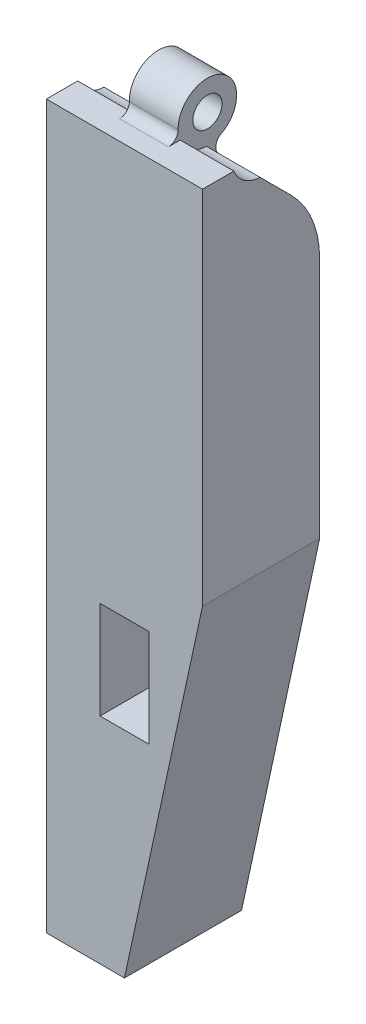
ISO-10303-21;
HEADER;
FILE_DESCRIPTION(('STEP AP214'),'2;1');
FILE_NAME('part.step','',(''),(''),'','','');
FILE_SCHEMA(('AUTOMOTIVE_DESIGN { 1 0 10303 214 1 1 1 1 }'));
ENDSEC;
DATA;
#1=APPLICATION_CONTEXT('core data for automotive mechanical design processes');
#2=APPLICATION_PROTOCOL_DEFINITION('international standard','automotive_design',2000,#1);
#3=PRODUCT_CONTEXT('',#1,'mechanical');
#4=PRODUCT('Part','Part','',(#3));
#5=PRODUCT_RELATED_PRODUCT_CATEGORY('part','',(#4));
#6=PRODUCT_DEFINITION_FORMATION('','',#4);
#7=PRODUCT_DEFINITION_CONTEXT('part definition',#1,'design');
#8=PRODUCT_DEFINITION('design','',#6,#7);
#9=PRODUCT_DEFINITION_SHAPE('','',#8);
#10=(LENGTH_UNIT() NAMED_UNIT(*) SI_UNIT(.MILLI.,.METRE.));
#11=(NAMED_UNIT(*) PLANE_ANGLE_UNIT() SI_UNIT($,.RADIAN.));
#12=(NAMED_UNIT(*) SI_UNIT($,.STERADIAN.) SOLID_ANGLE_UNIT());
#13=UNCERTAINTY_MEASURE_WITH_UNIT(LENGTH_MEASURE(1.E-05),#10,'distance_accuracy_value','');
#14=(GEOMETRIC_REPRESENTATION_CONTEXT(3) GLOBAL_UNCERTAINTY_ASSIGNED_CONTEXT((#13)) GLOBAL_UNIT_ASSIGNED_CONTEXT((#10,
#11,#12)) REPRESENTATION_CONTEXT('',''));
#15=CARTESIAN_POINT('',(0.,0.,0.));
#16=DIRECTION('',(0.,0.,1.));
#17=DIRECTION('',(1.,0.,0.));
#18=AXIS2_PLACEMENT_3D('',#15,#16,#17);
#19=CARTESIAN_POINT('',(0.,0.,0.));
#20=DIRECTION('',(0.,0.,-1.));
#21=DIRECTION('',(-1.,0.,0.));
#22=AXIS2_PLACEMENT_3D('',#19,#20,#21);
#23=PLANE('',#22);
#24=DIRECTION('',(-1.,0.,0.));
#25=VECTOR('',#24,1.);
#26=CARTESIAN_POINT('',(0.,-5.86718317653569,0.));
#27=LINE('',#26,#25);
#28=CARTESIAN_POINT('',(10.5,-5.86718317653569,0.));
#29=VERTEX_POINT('',#28);
#30=CARTESIAN_POINT('',(5.5,-5.86718317653569,0.));
#31=VERTEX_POINT('',#30);
#32=EDGE_CURVE('E267',#29,#31,#27,.T.);
#33=ORIENTED_EDGE('',*,*,#32,.F.);
#34=DIRECTION('',(0.,1.,0.));
#35=VECTOR('',#34,1.);
#36=CARTESIAN_POINT('',(10.5,0.,0.));
#37=LINE('',#36,#35);
#38=CARTESIAN_POINT('',(10.5,4.13281682346432,0.));
#39=VERTEX_POINT('',#38);
#40=EDGE_CURVE('E260',#29,#39,#37,.T.);
#41=ORIENTED_EDGE('',*,*,#40,.T.);
#42=DIRECTION('',(-1.,0.,0.));
#43=VECTOR('',#42,1.);
#44=CARTESIAN_POINT('',(0.,4.13281682346432,0.));
#45=LINE('',#44,#43);
#46=CARTESIAN_POINT('',(5.5,4.13281682346432,0.));
#47=VERTEX_POINT('',#46);
#48=EDGE_CURVE('E273',#39,#47,#45,.T.);
#49=ORIENTED_EDGE('',*,*,#48,.T.);
#50=DIRECTION('',(0.,1.,0.));
#51=VECTOR('',#50,1.);
#52=CARTESIAN_POINT('',(5.5,0.,0.));
#53=LINE('',#52,#51);
#54=EDGE_CURVE('E270',#31,#47,#53,.T.);
#55=ORIENTED_EDGE('',*,*,#54,.F.);
#56=EDGE_LOOP('',(#33,#41,#49,#55));
#57=FACE_BOUND('',#56,.T.);
#58=DIRECTION('',(0.,-1.,0.));
#59=VECTOR('',#58,1.);
#60=CARTESIAN_POINT('',(0.,26.1328168234643,0.));
#61=LINE('',#60,#59);
#62=CARTESIAN_POINT('',(0.,13.9906811997334,0.));
#63=VERTEX_POINT('',#62);
#64=CARTESIAN_POINT('',(0.,-47.8671831765357,0.));
#65=VERTEX_POINT('',#64);
#66=EDGE_CURVE('E349',#63,#65,#61,.T.);
#67=ORIENTED_EDGE('',*,*,#66,.F.);
#68=DIRECTION('',(1.,0.,0.));
#69=VECTOR('',#68,1.);
#70=CARTESIAN_POINT('',(16.,13.9906811997334,0.));
#71=LINE('',#70,#69);
#72=CARTESIAN_POINT('',(16.,13.9906811997334,0.));
#73=VERTEX_POINT('',#72);
#74=EDGE_CURVE('E443',#63,#73,#71,.T.);
#75=ORIENTED_EDGE('',*,*,#74,.T.);
#76=DIRECTION('',(0.,1.,0.));
#77=VECTOR('',#76,1.);
#78=CARTESIAN_POINT('',(16.,26.1328168234643,0.));
#79=LINE('',#78,#77);
#80=CARTESIAN_POINT('',(16.,-10.8671831765357,0.));
#81=VERTEX_POINT('',#80);
#82=EDGE_CURVE('E355',#81,#73,#79,.T.);
#83=ORIENTED_EDGE('',*,*,#82,.F.);
#84=DIRECTION('',(0.211332792527539,0.977414165439867,0.));
#85=VECTOR('',#84,1.);
#86=CARTESIAN_POINT('',(8.,-47.8671831765357,0.));
#87=LINE('',#86,#85);
#88=CARTESIAN_POINT('',(8.,-47.8671831765357,0.));
#89=VERTEX_POINT('',#88);
#90=EDGE_CURVE('E373',#89,#81,#87,.T.);
#91=ORIENTED_EDGE('',*,*,#90,.F.);
#92=DIRECTION('',(1.,0.,0.));
#93=VECTOR('',#92,1.);
#94=CARTESIAN_POINT('',(0.,-47.8671831765357,0.));
#95=LINE('',#94,#93);
#96=EDGE_CURVE('E370',#65,#89,#95,.T.);
#97=ORIENTED_EDGE('',*,*,#96,.F.);
#98=EDGE_LOOP('',(#67,#75,#83,#91,#97));
#99=FACE_BOUND('',#98,.T.);
#100=DIRECTION('',(-1.,0.,0.));
#101=VECTOR('',#100,1.);
#102=CARTESIAN_POINT('',(0.,-15.8671831765357,0.));
#103=LINE('',#102,#101);
#104=CARTESIAN_POINT('',(10.5,-15.8671831765357,0.));
#105=VERTEX_POINT('',#104);
#106=CARTESIAN_POINT('',(5.5,-15.8671831765357,0.));
#107=VERTEX_POINT('',#106);
#108=EDGE_CURVE('E295',#105,#107,#103,.T.);
#109=ORIENTED_EDGE('',*,*,#108,.T.);
#110=DIRECTION('',(0.,-1.,0.));
#111=VECTOR('',#110,1.);
#112=CARTESIAN_POINT('',(5.5,0.,0.));
#113=LINE('',#112,#111);
#114=CARTESIAN_POINT('',(5.5,-25.8671831765357,0.));
#115=VERTEX_POINT('',#114);
#116=EDGE_CURVE('E255',#107,#115,#113,.T.);
#117=ORIENTED_EDGE('',*,*,#116,.T.);
#118=DIRECTION('',(-1.,0.,0.));
#119=VECTOR('',#118,1.);
#120=CARTESIAN_POINT('',(0.,-25.8671831765357,0.));
#121=LINE('',#120,#119);
#122=CARTESIAN_POINT('',(10.5,-25.8671831765357,0.));
#123=VERTEX_POINT('',#122);
#124=EDGE_CURVE('E301',#123,#115,#121,.T.);
#125=ORIENTED_EDGE('',*,*,#124,.F.);
#126=DIRECTION('',(0.,-1.,0.));
#127=VECTOR('',#126,1.);
#128=CARTESIAN_POINT('',(10.5,0.,0.));
#129=LINE('',#128,#127);
#130=EDGE_CURVE('E209',#105,#123,#129,.T.);
#131=ORIENTED_EDGE('',*,*,#130,.F.);
#132=EDGE_LOOP('',(#109,#117,#125,#131));
#133=FACE_BOUND('',#132,.T.);
#134=ADVANCED_FACE('F38',(#57,#99,#133),#23,.T.);
#135=CARTESIAN_POINT('',(0.,27.2328168234643,6.));
#136=DIRECTION('',(1.,0.,0.));
#137=DIRECTION('',(0.,0.,-1.));
#138=AXIS2_PLACEMENT_3D('',#135,#136,#137);
#139=CYLINDRICAL_SURFACE('',#138,3.);
#140=CARTESIAN_POINT('',(5.5,27.2328168234643,6.));
#141=DIRECTION('',(1.,0.,0.));
#142=DIRECTION('',(0.,0.,-1.));
#143=AXIS2_PLACEMENT_3D('',#140,#141,#142);
#144=CIRCLE('',#143,3.);
#145=CARTESIAN_POINT('',(5.5,26.1328168234643,8.79105714739057));
#146=VERTEX_POINT('',#145);
#147=CARTESIAN_POINT('',(5.5,24.2345419876683,6.10172516420398));
#148=VERTEX_POINT('',#147);
#149=EDGE_CURVE('E325',#146,#148,#144,.T.);
#150=ORIENTED_EDGE('',*,*,#149,.T.);
#151=DIRECTION('',(1.,0.,0.));
#152=VECTOR('',#151,1.);
#153=CARTESIAN_POINT('',(0.,24.2345419876683,6.10172516420398));
#154=LINE('',#153,#152);
#155=CARTESIAN_POINT('',(0.,24.2345419876683,6.10172516420398));
#156=VERTEX_POINT('',#155);
#157=EDGE_CURVE('E399',#156,#148,#154,.T.);
#158=ORIENTED_EDGE('',*,*,#157,.F.);
#159=CARTESIAN_POINT('',(0.,27.2328168234643,6.));
#160=DIRECTION('',(1.,0.,0.));
#161=DIRECTION('',(0.,0.,-1.));
#162=AXIS2_PLACEMENT_3D('',#159,#160,#161);
#163=CIRCLE('',#162,3.);
#164=CARTESIAN_POINT('',(0.,26.1328168234643,8.79105714739057));
#165=VERTEX_POINT('',#164);
#166=EDGE_CURVE('E332',#165,#156,#163,.T.);
#167=ORIENTED_EDGE('',*,*,#166,.F.);
#168=DIRECTION('',(1.,0.,0.));
#169=VECTOR('',#168,1.);
#170=CARTESIAN_POINT('',(0.,26.1328168234643,8.79105714739057));
#171=LINE('',#170,#169);
#172=EDGE_CURVE('E336',#146,#165,#171,.F.);
#173=ORIENTED_EDGE('',*,*,#172,.F.);
#174=EDGE_LOOP('',(#150,#158,#167,#173));
#175=FACE_BOUND('',#174,.T.);
#176=ADVANCED_FACE('F489',(#175),#139,.F.);
#177=CARTESIAN_POINT('',(0.,26.1328168234643,12.));
#178=DIRECTION('',(0.,-1.,0.));
#179=DIRECTION('',(0.,0.,-1.));
#180=AXIS2_PLACEMENT_3D('',#177,#178,#179);
#181=PLANE('',#180);
#182=DIRECTION('',(1.,0.,0.));
#183=VECTOR('',#182,1.);
#184=CARTESIAN_POINT('',(5.5,26.1328168234643,9.99874980462644));
#185=LINE('',#184,#183);
#186=CARTESIAN_POINT('',(10.5,26.1328168234643,9.99874980462644));
#187=VERTEX_POINT('',#186);
#188=CARTESIAN_POINT('',(5.5,26.1328168234643,9.99874980462644));
#189=VERTEX_POINT('',#188);
#190=EDGE_CURVE('E407',#187,#189,#185,.F.);
#191=ORIENTED_EDGE('',*,*,#190,.T.);
#192=DIRECTION('',(0.,0.,-1.));
#193=VECTOR('',#192,1.);
#194=CARTESIAN_POINT('',(5.5,26.1328168234643,6.));
#195=LINE('',#194,#193);
#196=EDGE_CURVE('E411',#189,#146,#195,.T.);
#197=ORIENTED_EDGE('',*,*,#196,.T.);
#198=ORIENTED_EDGE('',*,*,#172,.T.);
#199=DIRECTION('',(0.,0.,-1.));
#200=VECTOR('',#199,1.);
#201=CARTESIAN_POINT('',(0.,26.1328168234643,12.));
#202=LINE('',#201,#200);
#203=CARTESIAN_POINT('',(0.,26.1328168234643,12.));
#204=VERTEX_POINT('',#203);
#205=EDGE_CURVE('E394',#204,#165,#202,.T.);
#206=ORIENTED_EDGE('',*,*,#205,.F.);
#207=DIRECTION('',(-1.,0.,0.));
#208=VECTOR('',#207,1.);
#209=CARTESIAN_POINT('',(0.,26.1328168234643,12.));
#210=LINE('',#209,#208);
#211=CARTESIAN_POINT('',(16.,26.1328168234643,12.));
#212=VERTEX_POINT('',#211);
#213=EDGE_CURVE('E350',#212,#204,#210,.T.);
#214=ORIENTED_EDGE('',*,*,#213,.F.);
#215=DIRECTION('',(0.,0.,-1.));
#216=VECTOR('',#215,1.);
#217=CARTESIAN_POINT('',(16.,26.1328168234643,12.));
#218=LINE('',#217,#216);
#219=CARTESIAN_POINT('',(16.,26.1328168234643,8.79105714739057));
#220=VERTEX_POINT('',#219);
#221=EDGE_CURVE('E367',#212,#220,#218,.T.);
#222=ORIENTED_EDGE('',*,*,#221,.T.);
#223=CARTESIAN_POINT('',(10.5,26.1328168234643,8.79105714739057));
#224=VERTEX_POINT('',#223);
#225=EDGE_CURVE('E337',#220,#224,#171,.F.);
#226=ORIENTED_EDGE('',*,*,#225,.T.);
#227=DIRECTION('',(0.,0.,1.));
#228=VECTOR('',#227,1.);
#229=CARTESIAN_POINT('',(10.5,26.1328168234643,12.));
#230=LINE('',#229,#228);
#231=EDGE_CURVE('E403',#224,#187,#230,.T.);
#232=ORIENTED_EDGE('',*,*,#231,.T.);
#233=EDGE_LOOP('',(#191,#197,#198,#206,#214,#222,#226,#232));
#234=FACE_BOUND('',#233,.T.);
#235=ADVANCED_FACE('F483',(#234),#181,.F.);
#236=CARTESIAN_POINT('',(0.,26.1328168234643,12.));
#237=DIRECTION('',(1.,0.,0.));
#238=DIRECTION('',(0.,1.,0.));
#239=AXIS2_PLACEMENT_3D('',#236,#237,#238);
#240=PLANE('',#239);
#241=DIRECTION('',(0.,-0.707106781186548,-0.707106781186548));
#242=VECTOR('',#241,1.);
#243=CARTESIAN_POINT('',(0.,26.1328168234643,8.));
#244=LINE('',#243,#242);
#245=CARTESIAN_POINT('',(0.,21.0617490115988,2.92893218813452));
#246=VERTEX_POINT('',#245);
#247=EDGE_CURVE('E345',#156,#246,#244,.T.);
#248=ORIENTED_EDGE('',*,*,#247,.T.);
#249=CARTESIAN_POINT('',(0.,13.9906811997334,10.));
#250=DIRECTION('',(1.,0.,0.));
#251=DIRECTION('',(0.,1.,0.));
#252=AXIS2_PLACEMENT_3D('',#249,#250,#251);
#253=CIRCLE('',#252,10.);
#254=EDGE_CURVE('E11',#246,#63,#253,.F.);
#255=ORIENTED_EDGE('',*,*,#254,.T.);
#256=ORIENTED_EDGE('',*,*,#66,.T.);
#257=DIRECTION('',(0.,0.,-1.));
#258=VECTOR('',#257,1.);
#259=CARTESIAN_POINT('',(0.,-47.8671831765357,12.));
#260=LINE('',#259,#258);
#261=CARTESIAN_POINT('',(0.,-47.8671831765357,12.));
#262=VERTEX_POINT('',#261);
#263=EDGE_CURVE('E390',#262,#65,#260,.T.);
#264=ORIENTED_EDGE('',*,*,#263,.F.);
#265=DIRECTION('',(0.,-1.,0.));
#266=VECTOR('',#265,1.);
#267=CARTESIAN_POINT('',(0.,26.1328168234643,12.));
#268=LINE('',#267,#266);
#269=EDGE_CURVE('E354',#204,#262,#268,.T.);
#270=ORIENTED_EDGE('',*,*,#269,.F.);
#271=ORIENTED_EDGE('',*,*,#205,.T.);
#272=ORIENTED_EDGE('',*,*,#166,.T.);
#273=EDGE_LOOP('',(#248,#255,#256,#264,#270,#271,#272));
#274=FACE_BOUND('',#273,.T.);
#275=ADVANCED_FACE('F458',(#274),#240,.F.);
#276=CARTESIAN_POINT('',(0.,-47.8671831765357,12.));
#277=DIRECTION('',(0.,1.,0.));
#278=DIRECTION('',(0.,0.,1.));
#279=AXIS2_PLACEMENT_3D('',#276,#277,#278);
#280=PLANE('',#279);
#281=ORIENTED_EDGE('',*,*,#96,.T.);
#282=DIRECTION('',(0.,0.,-1.));
#283=VECTOR('',#282,1.);
#284=CARTESIAN_POINT('',(8.,-47.8671831765357,12.));
#285=LINE('',#284,#283);
#286=CARTESIAN_POINT('',(8.,-47.8671831765357,12.));
#287=VERTEX_POINT('',#286);
#288=EDGE_CURVE('E386',#287,#89,#285,.T.);
#289=ORIENTED_EDGE('',*,*,#288,.F.);
#290=DIRECTION('',(1.,0.,0.));
#291=VECTOR('',#290,1.);
#292=CARTESIAN_POINT('',(0.,-47.8671831765357,12.));
#293=LINE('',#292,#291);
#294=EDGE_CURVE('E358',#262,#287,#293,.T.);
#295=ORIENTED_EDGE('',*,*,#294,.F.);
#296=ORIENTED_EDGE('',*,*,#263,.T.);
#297=EDGE_LOOP('',(#281,#289,#295,#296));
#298=FACE_BOUND('',#297,.T.);
#299=ADVANCED_FACE('F477',(#298),#280,.F.);
#300=CARTESIAN_POINT('',(8.,-47.8671831765357,12.));
#301=DIRECTION('',(-0.977414165439867,0.211332792527539,0.));
#302=DIRECTION('',(-0.211332792527539,-0.977414165439867,0.));
#303=AXIS2_PLACEMENT_3D('',#300,#301,#302);
#304=PLANE('',#303);
#305=ORIENTED_EDGE('',*,*,#90,.T.);
#306=DIRECTION('',(0.,0.,-1.));
#307=VECTOR('',#306,1.);
#308=CARTESIAN_POINT('',(16.,-10.8671831765357,12.));
#309=LINE('',#308,#307);
#310=CARTESIAN_POINT('',(16.,-10.8671831765357,12.));
#311=VERTEX_POINT('',#310);
#312=EDGE_CURVE('E382',#311,#81,#309,.T.);
#313=ORIENTED_EDGE('',*,*,#312,.F.);
#314=DIRECTION('',(0.211332792527539,0.977414165439867,0.));
#315=VECTOR('',#314,1.);
#316=CARTESIAN_POINT('',(8.,-47.8671831765357,12.));
#317=LINE('',#316,#315);
#318=EDGE_CURVE('E361',#287,#311,#317,.T.);
#319=ORIENTED_EDGE('',*,*,#318,.F.);
#320=ORIENTED_EDGE('',*,*,#288,.T.);
#321=EDGE_LOOP('',(#305,#313,#319,#320));
#322=FACE_BOUND('',#321,.T.);
#323=ADVANCED_FACE('F474',(#322),#304,.F.);
#324=CARTESIAN_POINT('',(16.,26.1328168234643,12.));
#325=DIRECTION('',(-1.,0.,0.));
#326=DIRECTION('',(0.,-1.,0.));
#327=AXIS2_PLACEMENT_3D('',#324,#325,#326);
#328=PLANE('',#327);
#329=ORIENTED_EDGE('',*,*,#82,.T.);
#330=CARTESIAN_POINT('',(16.,13.9906811997334,10.));
#331=DIRECTION('',(-1.,0.,0.));
#332=DIRECTION('',(0.,-1.,0.));
#333=AXIS2_PLACEMENT_3D('',#330,#331,#332);
#334=CIRCLE('',#333,10.);
#335=CARTESIAN_POINT('',(16.,21.0617490115988,2.92893218813452));
#336=VERTEX_POINT('',#335);
#337=EDGE_CURVE('E447',#73,#336,#334,.F.);
#338=ORIENTED_EDGE('',*,*,#337,.T.);
#339=DIRECTION('',(0.,-0.707106781186548,-0.707106781186548));
#340=VECTOR('',#339,1.);
#341=CARTESIAN_POINT('',(16.,26.1328168234643,8.));
#342=LINE('',#341,#340);
#343=CARTESIAN_POINT('',(16.,24.2345419876683,6.10172516420398));
#344=VERTEX_POINT('',#343);
#345=EDGE_CURVE('E341',#344,#336,#342,.T.);
#346=ORIENTED_EDGE('',*,*,#345,.F.);
#347=CARTESIAN_POINT('',(16.,27.2328168234643,6.));
#348=DIRECTION('',(1.,0.,0.));
#349=DIRECTION('',(0.,0.,-1.));
#350=AXIS2_PLACEMENT_3D('',#347,#348,#349);
#351=CIRCLE('',#350,3.);
#352=EDGE_CURVE('E323',#220,#344,#351,.T.);
#353=ORIENTED_EDGE('',*,*,#352,.F.);
#354=ORIENTED_EDGE('',*,*,#221,.F.);
#355=DIRECTION('',(0.,1.,0.));
#356=VECTOR('',#355,1.);
#357=CARTESIAN_POINT('',(16.,26.1328168234643,12.));
#358=LINE('',#357,#356);
#359=EDGE_CURVE('E364',#311,#212,#358,.T.);
#360=ORIENTED_EDGE('',*,*,#359,.F.);
#361=ORIENTED_EDGE('',*,*,#312,.T.);
#362=EDGE_LOOP('',(#329,#338,#346,#353,#354,#360,#361));
#363=FACE_BOUND('',#362,.T.);
#364=ADVANCED_FACE('F468',(#363),#328,.F.);
#365=CARTESIAN_POINT('',(0.,0.,12.));
#366=DIRECTION('',(0.,0.,-1.));
#367=DIRECTION('',(-1.,0.,0.));
#368=AXIS2_PLACEMENT_3D('',#365,#366,#367);
#369=PLANE('',#368);
#370=DIRECTION('',(1.,0.,0.));
#371=VECTOR('',#370,1.);
#372=CARTESIAN_POINT('',(10.5,-15.8671831765357,12.));
#373=LINE('',#372,#371);
#374=CARTESIAN_POINT('',(5.5,-15.8671831765357,12.));
#375=VERTEX_POINT('',#374);
#376=CARTESIAN_POINT('',(10.5,-15.8671831765357,12.));
#377=VERTEX_POINT('',#376);
#378=EDGE_CURVE('E225',#375,#377,#373,.T.);
#379=ORIENTED_EDGE('',*,*,#378,.T.);
#380=DIRECTION('',(0.,-1.,0.));
#381=VECTOR('',#380,1.);
#382=CARTESIAN_POINT('',(10.5,-15.8671831765357,12.));
#383=LINE('',#382,#381);
#384=CARTESIAN_POINT('',(10.5,-25.8671831765357,12.));
#385=VERTEX_POINT('',#384);
#386=EDGE_CURVE('E206',#377,#385,#383,.T.);
#387=ORIENTED_EDGE('',*,*,#386,.T.);
#388=DIRECTION('',(-1.,0.,0.));
#389=VECTOR('',#388,1.);
#390=CARTESIAN_POINT('',(10.5,-25.8671831765357,12.));
#391=LINE('',#390,#389);
#392=CARTESIAN_POINT('',(5.5,-25.8671831765357,12.));
#393=VERTEX_POINT('',#392);
#394=EDGE_CURVE('E215',#385,#393,#391,.T.);
#395=ORIENTED_EDGE('',*,*,#394,.T.);
#396=DIRECTION('',(0.,1.,0.));
#397=VECTOR('',#396,1.);
#398=CARTESIAN_POINT('',(5.5,-15.8671831765357,12.));
#399=LINE('',#398,#397);
#400=EDGE_CURVE('E220',#393,#375,#399,.T.);
#401=ORIENTED_EDGE('',*,*,#400,.T.);
#402=EDGE_LOOP('',(#379,#387,#395,#401));
#403=FACE_BOUND('',#402,.T.);
#404=ORIENTED_EDGE('',*,*,#213,.T.);
#405=ORIENTED_EDGE('',*,*,#269,.T.);
#406=ORIENTED_EDGE('',*,*,#294,.T.);
#407=ORIENTED_EDGE('',*,*,#318,.T.);
#408=ORIENTED_EDGE('',*,*,#359,.T.);
#409=EDGE_LOOP('',(#404,#405,#406,#407,#408));
#410=FACE_BOUND('',#409,.T.);
#411=ADVANCED_FACE('F222',(#403,#410),#369,.F.);
#412=CARTESIAN_POINT('',(0.,26.1328168234643,8.));
#413=DIRECTION('',(0.,-0.707106781186547,0.707106781186547));
#414=DIRECTION('',(0.,-0.707106781186548,-0.707106781186548));
#415=AXIS2_PLACEMENT_3D('',#412,#413,#414);
#416=PLANE('',#415);
#417=ORIENTED_EDGE('',*,*,#345,.T.);
#418=DIRECTION('',(1.,0.,0.));
#419=VECTOR('',#418,1.);
#420=CARTESIAN_POINT('',(0.,21.0617490115988,2.92893218813453));
#421=LINE('',#420,#419);
#422=EDGE_CURVE('E47',#336,#246,#421,.F.);
#423=ORIENTED_EDGE('',*,*,#422,.T.);
#424=ORIENTED_EDGE('',*,*,#247,.F.);
#425=ORIENTED_EDGE('',*,*,#157,.T.);
#426=DIRECTION('',(0.,-0.707106781186548,-0.707106781186548));
#427=VECTOR('',#426,1.);
#428=CARTESIAN_POINT('',(5.5,25.6828168234643,7.55));
#429=LINE('',#428,#427);
#430=CARTESIAN_POINT('',(5.5,22.9829036726985,4.85008684923417));
#431=VERTEX_POINT('',#430);
#432=EDGE_CURVE('E420',#148,#431,#429,.T.);
#433=ORIENTED_EDGE('',*,*,#432,.T.);
#434=DIRECTION('',(1.,0.,0.));
#435=VECTOR('',#434,1.);
#436=CARTESIAN_POINT('',(10.5,22.9829036726985,4.85008684923417));
#437=LINE('',#436,#435);
#438=CARTESIAN_POINT('',(10.5,22.9829036726985,4.85008684923417));
#439=VERTEX_POINT('',#438);
#440=EDGE_CURVE('E424',#431,#439,#437,.T.);
#441=ORIENTED_EDGE('',*,*,#440,.T.);
#442=DIRECTION('',(0.,0.707106781186548,0.707106781186548));
#443=VECTOR('',#442,1.);
#444=CARTESIAN_POINT('',(10.5,26.1328168234643,8.));
#445=LINE('',#444,#443);
#446=CARTESIAN_POINT('',(10.5,24.2345419876683,6.10172516420398));
#447=VERTEX_POINT('',#446);
#448=EDGE_CURVE('E428',#439,#447,#445,.T.);
#449=ORIENTED_EDGE('',*,*,#448,.T.);
#450=EDGE_CURVE('E398',#447,#344,#154,.T.);
#451=ORIENTED_EDGE('',*,*,#450,.T.);
#452=EDGE_LOOP('',(#417,#423,#424,#425,#433,#441,#449,#451));
#453=FACE_BOUND('',#452,.T.);
#454=ADVANCED_FACE('F453',(#453),#416,.F.);
#455=ORIENTED_EDGE('',*,*,#450,.F.);
#456=CARTESIAN_POINT('',(10.5,27.2328168234643,6.));
#457=DIRECTION('',(1.,0.,0.));
#458=DIRECTION('',(0.,0.,-1.));
#459=AXIS2_PLACEMENT_3D('',#456,#457,#458);
#460=CIRCLE('',#459,3.);
#461=EDGE_CURVE('E319',#224,#447,#460,.T.);
#462=ORIENTED_EDGE('',*,*,#461,.F.);
#463=ORIENTED_EDGE('',*,*,#225,.F.);
#464=ORIENTED_EDGE('',*,*,#352,.T.);
#465=EDGE_LOOP('',(#455,#462,#463,#464));
#466=FACE_BOUND('',#465,.T.);
#467=ADVANCED_FACE('F505',(#466),#139,.F.);
#468=CARTESIAN_POINT('',(10.5,27.2328168234643,6.));
#469=DIRECTION('',(-1.,0.,0.));
#470=DIRECTION('',(0.,0.,1.));
#471=AXIS2_PLACEMENT_3D('',#468,#469,#470);
#472=CYLINDRICAL_SURFACE('',#471,3.);
#473=CARTESIAN_POINT('',(5.5,24.5757120462798,4.60723505103571));
#474=VERTEX_POINT('',#473);
#475=CARTESIAN_POINT('',(5.5,27.1578168234643,8.99906235346983));
#476=VERTEX_POINT('',#475);
#477=EDGE_CURVE('E315',#474,#476,#144,.T.);
#478=ORIENTED_EDGE('',*,*,#477,.T.);
#479=DIRECTION('',(-1.,0.,0.));
#480=VECTOR('',#479,1.);
#481=CARTESIAN_POINT('',(10.5,27.1578168234643,8.99906235346983));
#482=LINE('',#481,#480);
#483=CARTESIAN_POINT('',(10.5,27.1578168234643,8.99906235346983));
#484=VERTEX_POINT('',#483);
#485=EDGE_CURVE('E417',#476,#484,#482,.F.);
#486=ORIENTED_EDGE('',*,*,#485,.T.);
#487=CARTESIAN_POINT('',(10.5,24.5757120462798,4.60723505103571));
#488=VERTEX_POINT('',#487);
#489=EDGE_CURVE('E324',#488,#484,#460,.T.);
#490=ORIENTED_EDGE('',*,*,#489,.F.);
#491=DIRECTION('',(-1.,0.,0.));
#492=VECTOR('',#491,1.);
#493=CARTESIAN_POINT('',(10.5,24.5757120462798,4.60723505103571));
#494=LINE('',#493,#492);
#495=EDGE_CURVE('E414',#488,#474,#494,.T.);
#496=ORIENTED_EDGE('',*,*,#495,.T.);
#497=EDGE_LOOP('',(#478,#486,#490,#496));
#498=FACE_BOUND('',#497,.T.);
#499=ADVANCED_FACE('F514',(#498),#472,.T.);
#500=CARTESIAN_POINT('',(10.5,27.2328168234643,6.));
#501=DIRECTION('',(1.,0.,0.));
#502=DIRECTION('',(0.,0.,-1.));
#503=AXIS2_PLACEMENT_3D('',#500,#501,#502);
#504=PLANE('',#503);
#505=ORIENTED_EDGE('',*,*,#461,.T.);
#506=ORIENTED_EDGE('',*,*,#448,.F.);
#507=CARTESIAN_POINT('',(10.5,23.690010453885,4.14298006804762));
#508=DIRECTION('',(1.,0.,0.));
#509=DIRECTION('',(0.,0.,-1.));
#510=AXIS2_PLACEMENT_3D('',#507,#508,#509);
#511=CIRCLE('',#510,1.);
#512=EDGE_CURVE('E437',#439,#488,#511,.F.);
#513=ORIENTED_EDGE('',*,*,#512,.T.);
#514=ORIENTED_EDGE('',*,*,#489,.T.);
#515=CARTESIAN_POINT('',(10.5,27.1328168234643,9.99874980462644));
#516=DIRECTION('',(1.,0.,0.));
#517=DIRECTION('',(0.,0.,-1.));
#518=AXIS2_PLACEMENT_3D('',#515,#516,#517);
#519=CIRCLE('',#518,1.);
#520=EDGE_CURVE('E434',#484,#187,#519,.F.);
#521=ORIENTED_EDGE('',*,*,#520,.T.);
#522=ORIENTED_EDGE('',*,*,#231,.F.);
#523=EDGE_LOOP('',(#505,#506,#513,#514,#521,#522));
#524=FACE_BOUND('',#523,.T.);
#525=CARTESIAN_POINT('',(10.5,27.2328168234643,6.));
#526=DIRECTION('',(1.,0.,0.));
#527=DIRECTION('',(0.,0.,-1.));
#528=AXIS2_PLACEMENT_3D('',#525,#526,#527);
#529=CIRCLE('',#528,1.5);
#530=CARTESIAN_POINT('',(10.5,27.2328168234643,4.5));
#531=VERTEX_POINT('',#530);
#532=EDGE_CURVE('E311',#531,#531,#529,.T.);
#533=ORIENTED_EDGE('',*,*,#532,.F.);
#534=EDGE_LOOP('',(#533));
#535=FACE_BOUND('',#534,.T.);
#536=ADVANCED_FACE('F500',(#524,#535),#504,.T.);
#537=CARTESIAN_POINT('',(5.5,27.2328168234643,6.));
#538=DIRECTION('',(1.,0.,0.));
#539=DIRECTION('',(0.,0.,-1.));
#540=AXIS2_PLACEMENT_3D('',#537,#538,#539);
#541=PLANE('',#540);
#542=ORIENTED_EDGE('',*,*,#149,.F.);
#543=ORIENTED_EDGE('',*,*,#196,.F.);
#544=CARTESIAN_POINT('',(5.5,27.1328168234643,9.99874980462644));
#545=DIRECTION('',(1.,0.,0.));
#546=DIRECTION('',(0.,0.,-1.));
#547=AXIS2_PLACEMENT_3D('',#544,#545,#546);
#548=CIRCLE('',#547,1.);
#549=EDGE_CURVE('E431',#189,#476,#548,.T.);
#550=ORIENTED_EDGE('',*,*,#549,.T.);
#551=ORIENTED_EDGE('',*,*,#477,.F.);
#552=CARTESIAN_POINT('',(5.5,23.690010453885,4.14298006804762));
#553=DIRECTION('',(1.,0.,0.));
#554=DIRECTION('',(0.,0.,-1.));
#555=AXIS2_PLACEMENT_3D('',#552,#553,#554);
#556=CIRCLE('',#555,1.);
#557=EDGE_CURVE('E440',#474,#431,#556,.T.);
#558=ORIENTED_EDGE('',*,*,#557,.T.);
#559=ORIENTED_EDGE('',*,*,#432,.F.);
#560=EDGE_LOOP('',(#542,#543,#550,#551,#558,#559));
#561=FACE_BOUND('',#560,.T.);
#562=CARTESIAN_POINT('',(5.5,27.2328168234643,6.));
#563=DIRECTION('',(1.,0.,0.));
#564=DIRECTION('',(0.,0.,-1.));
#565=AXIS2_PLACEMENT_3D('',#562,#563,#564);
#566=CIRCLE('',#565,1.5);
#567=CARTESIAN_POINT('',(5.5,27.2328168234643,4.5));
#568=VERTEX_POINT('',#567);
#569=EDGE_CURVE('E283',#568,#568,#566,.T.);
#570=ORIENTED_EDGE('',*,*,#569,.T.);
#571=EDGE_LOOP('',(#570));
#572=FACE_BOUND('',#571,.T.);
#573=ADVANCED_FACE('F519',(#561,#572),#541,.F.);
#574=CARTESIAN_POINT('',(10.5,27.2328168234643,6.));
#575=DIRECTION('',(-1.,0.,0.));
#576=DIRECTION('',(0.,0.,1.));
#577=AXIS2_PLACEMENT_3D('',#574,#575,#576);
#578=CYLINDRICAL_SURFACE('',#577,1.5);
#579=ORIENTED_EDGE('',*,*,#532,.T.);
#580=EDGE_LOOP('',(#579));
#581=FACE_BOUND('',#580,.T.);
#582=ORIENTED_EDGE('',*,*,#569,.F.);
#583=EDGE_LOOP('',(#582));
#584=FACE_BOUND('',#583,.T.);
#585=ADVANCED_FACE('F522',(#581,#584),#578,.F.);
#586=CARTESIAN_POINT('',(10.5,27.1328168234643,9.99874980462644));
#587=DIRECTION('',(-1.,0.,0.));
#588=DIRECTION('',(0.,0.,1.));
#589=AXIS2_PLACEMENT_3D('',#586,#587,#588);
#590=CYLINDRICAL_SURFACE('',#589,1.);
#591=ORIENTED_EDGE('',*,*,#520,.F.);
#592=ORIENTED_EDGE('',*,*,#485,.F.);
#593=ORIENTED_EDGE('',*,*,#549,.F.);
#594=ORIENTED_EDGE('',*,*,#190,.F.);
#595=EDGE_LOOP('',(#591,#592,#593,#594));
#596=FACE_BOUND('',#595,.T.);
#597=ADVANCED_FACE('F517',(#596),#590,.F.);
#598=CARTESIAN_POINT('',(10.5,23.690010453885,4.14298006804762));
#599=DIRECTION('',(-1.,0.,0.));
#600=DIRECTION('',(0.,0.,1.));
#601=AXIS2_PLACEMENT_3D('',#598,#599,#600);
#602=CYLINDRICAL_SURFACE('',#601,1.);
#603=ORIENTED_EDGE('',*,*,#557,.F.);
#604=ORIENTED_EDGE('',*,*,#495,.F.);
#605=ORIENTED_EDGE('',*,*,#512,.F.);
#606=ORIENTED_EDGE('',*,*,#440,.F.);
#607=EDGE_LOOP('',(#603,#604,#605,#606));
#608=FACE_BOUND('',#607,.T.);
#609=ADVANCED_FACE('F494',(#608),#602,.F.);
#610=CARTESIAN_POINT('',(0.,13.9906811997334,10.));
#611=DIRECTION('',(-1.,0.,0.));
#612=DIRECTION('',(0.,0.,1.));
#613=AXIS2_PLACEMENT_3D('',#610,#611,#612);
#614=CYLINDRICAL_SURFACE('',#613,10.);
#615=ORIENTED_EDGE('',*,*,#254,.F.);
#616=ORIENTED_EDGE('',*,*,#422,.F.);
#617=ORIENTED_EDGE('',*,*,#337,.F.);
#618=ORIENTED_EDGE('',*,*,#74,.F.);
#619=EDGE_LOOP('',(#615,#616,#617,#618));
#620=FACE_BOUND('',#619,.T.);
#621=ADVANCED_FACE('F40',(#620),#614,.T.);
#622=CARTESIAN_POINT('',(0.,-25.8671831765357,5.));
#623=DIRECTION('',(0.,-1.,0.));
#624=DIRECTION('',(0.,0.,-1.));
#625=AXIS2_PLACEMENT_3D('',#622,#623,#624);
#626=PLANE('',#625);
#627=ORIENTED_EDGE('',*,*,#124,.T.);
#628=DIRECTION('',(0.,0.,-1.));
#629=VECTOR('',#628,1.);
#630=CARTESIAN_POINT('',(5.5,-25.8671831765357,5.));
#631=LINE('',#630,#629);
#632=EDGE_CURVE('E54',#393,#115,#631,.T.);
#633=ORIENTED_EDGE('',*,*,#632,.F.);
#634=ORIENTED_EDGE('',*,*,#394,.F.);
#635=DIRECTION('',(0.,0.,-1.));
#636=VECTOR('',#635,1.);
#637=CARTESIAN_POINT('',(10.5,-25.8671831765357,5.));
#638=LINE('',#637,#636);
#639=EDGE_CURVE('E202',#385,#123,#638,.T.);
#640=ORIENTED_EDGE('',*,*,#639,.T.);
#641=EDGE_LOOP('',(#627,#633,#634,#640));
#642=FACE_BOUND('',#641,.T.);
#643=ADVANCED_FACE('F216',(#642),#626,.F.);
#644=CARTESIAN_POINT('',(0.,-15.8671831765357,5.));
#645=DIRECTION('',(0.,-1.,0.));
#646=DIRECTION('',(0.,0.,-1.));
#647=AXIS2_PLACEMENT_3D('',#644,#645,#646);
#648=PLANE('',#647);
#649=DIRECTION('',(1.,0.,0.));
#650=VECTOR('',#649,1.);
#651=CARTESIAN_POINT('',(5.5,-15.8671831765357,2.5));
#652=LINE('',#651,#650);
#653=CARTESIAN_POINT('',(5.5,-15.8671831765357,2.5));
#654=VERTEX_POINT('',#653);
#655=CARTESIAN_POINT('',(10.5,-15.8671831765357,2.5));
#656=VERTEX_POINT('',#655);
#657=EDGE_CURVE('E242',#654,#656,#652,.T.);
#658=ORIENTED_EDGE('',*,*,#657,.F.);
#659=DIRECTION('',(0.,0.,-1.));
#660=VECTOR('',#659,1.);
#661=CARTESIAN_POINT('',(5.5,-15.8671831765357,5.));
#662=LINE('',#661,#660);
#663=EDGE_CURVE('E304',#654,#107,#662,.T.);
#664=ORIENTED_EDGE('',*,*,#663,.T.);
#665=ORIENTED_EDGE('',*,*,#108,.F.);
#666=DIRECTION('',(0.,0.,-1.));
#667=VECTOR('',#666,1.);
#668=CARTESIAN_POINT('',(10.5,-15.8671831765357,5.));
#669=LINE('',#668,#667);
#670=EDGE_CURVE('E212',#656,#105,#669,.T.);
#671=ORIENTED_EDGE('',*,*,#670,.F.);
#672=EDGE_LOOP('',(#658,#664,#665,#671));
#673=FACE_BOUND('',#672,.T.);
#674=ADVANCED_FACE('F564',(#673),#648,.T.);
#675=CARTESIAN_POINT('',(0.,-5.86718317653569,5.));
#676=DIRECTION('',(0.,-1.,0.));
#677=DIRECTION('',(0.,0.,-1.));
#678=AXIS2_PLACEMENT_3D('',#675,#676,#677);
#679=PLANE('',#678);
#680=DIRECTION('',(0.,0.,-1.));
#681=VECTOR('',#680,1.);
#682=CARTESIAN_POINT('',(5.5,-5.86718317653569,5.));
#683=LINE('',#682,#681);
#684=CARTESIAN_POINT('',(5.5,-5.86718317653569,2.5));
#685=VERTEX_POINT('',#684);
#686=EDGE_CURVE('E62',#685,#31,#683,.T.);
#687=ORIENTED_EDGE('',*,*,#686,.F.);
#688=DIRECTION('',(-1.,0.,0.));
#689=VECTOR('',#688,1.);
#690=CARTESIAN_POINT('',(5.5,-5.86718317653569,2.5));
#691=LINE('',#690,#689);
#692=CARTESIAN_POINT('',(10.5,-5.86718317653569,2.5));
#693=VERTEX_POINT('',#692);
#694=EDGE_CURVE('E250',#693,#685,#691,.T.);
#695=ORIENTED_EDGE('',*,*,#694,.F.);
#696=DIRECTION('',(0.,0.,-1.));
#697=VECTOR('',#696,1.);
#698=CARTESIAN_POINT('',(10.5,-5.86718317653569,5.));
#699=LINE('',#698,#697);
#700=EDGE_CURVE('E280',#693,#29,#699,.T.);
#701=ORIENTED_EDGE('',*,*,#700,.T.);
#702=ORIENTED_EDGE('',*,*,#32,.T.);
#703=EDGE_LOOP('',(#687,#695,#701,#702));
#704=FACE_BOUND('',#703,.T.);
#705=ADVANCED_FACE('F571',(#704),#679,.F.);
#706=CARTESIAN_POINT('',(10.5,0.,5.));
#707=DIRECTION('',(-1.,0.,0.));
#708=DIRECTION('',(0.,0.,1.));
#709=AXIS2_PLACEMENT_3D('',#706,#707,#708);
#710=PLANE('',#709);
#711=DIRECTION('',(0.,-1.,0.));
#712=VECTOR('',#711,1.);
#713=CARTESIAN_POINT('',(10.5,-0.277013232786212,2.5));
#714=LINE('',#713,#712);
#715=EDGE_CURVE('E247',#693,#656,#714,.T.);
#716=ORIENTED_EDGE('',*,*,#715,.T.);
#717=ORIENTED_EDGE('',*,*,#670,.T.);
#718=ORIENTED_EDGE('',*,*,#130,.T.);
#719=ORIENTED_EDGE('',*,*,#639,.F.);
#720=ORIENTED_EDGE('',*,*,#386,.F.);
#721=DIRECTION('',(0.,0.,-1.));
#722=VECTOR('',#721,1.);
#723=CARTESIAN_POINT('',(10.5,-15.8671831765357,12.));
#724=LINE('',#723,#722);
#725=CARTESIAN_POINT('',(10.5,-15.8671831765357,5.));
#726=VERTEX_POINT('',#725);
#727=EDGE_CURVE('E234',#377,#726,#724,.T.);
#728=ORIENTED_EDGE('',*,*,#727,.T.);
#729=DIRECTION('',(0.,1.,0.));
#730=VECTOR('',#729,1.);
#731=CARTESIAN_POINT('',(10.5,0.,5.));
#732=LINE('',#731,#730);
#733=CARTESIAN_POINT('',(10.5,4.13281682346432,5.));
#734=VERTEX_POINT('',#733);
#735=EDGE_CURVE('E264',#726,#734,#732,.T.);
#736=ORIENTED_EDGE('',*,*,#735,.T.);
#737=DIRECTION('',(0.,0.,-1.));
#738=VECTOR('',#737,1.);
#739=CARTESIAN_POINT('',(10.5,4.13281682346432,5.));
#740=LINE('',#739,#738);
#741=EDGE_CURVE('E284',#734,#39,#740,.T.);
#742=ORIENTED_EDGE('',*,*,#741,.T.);
#743=ORIENTED_EDGE('',*,*,#40,.F.);
#744=ORIENTED_EDGE('',*,*,#700,.F.);
#745=EDGE_LOOP('',(#716,#717,#718,#719,#720,#728,#736,#742,#743,#744));
#746=FACE_BOUND('',#745,.T.);
#747=ADVANCED_FACE('F203',(#746),#710,.T.);
#748=CARTESIAN_POINT('',(0.,4.13281682346432,5.));
#749=DIRECTION('',(0.,-1.,0.));
#750=DIRECTION('',(0.,0.,-1.));
#751=AXIS2_PLACEMENT_3D('',#748,#749,#750);
#752=PLANE('',#751);
#753=ORIENTED_EDGE('',*,*,#48,.F.);
#754=ORIENTED_EDGE('',*,*,#741,.F.);
#755=DIRECTION('',(-1.,0.,0.));
#756=VECTOR('',#755,1.);
#757=CARTESIAN_POINT('',(0.,4.13281682346432,5.));
#758=LINE('',#757,#756);
#759=CARTESIAN_POINT('',(5.5,4.13281682346432,5.));
#760=VERTEX_POINT('',#759);
#761=EDGE_CURVE('E259',#734,#760,#758,.T.);
#762=ORIENTED_EDGE('',*,*,#761,.T.);
#763=DIRECTION('',(0.,0.,-1.));
#764=VECTOR('',#763,1.);
#765=CARTESIAN_POINT('',(5.5,4.13281682346432,5.));
#766=LINE('',#765,#764);
#767=EDGE_CURVE('E287',#760,#47,#766,.T.);
#768=ORIENTED_EDGE('',*,*,#767,.T.);
#769=EDGE_LOOP('',(#753,#754,#762,#768));
#770=FACE_BOUND('',#769,.T.);
#771=ADVANCED_FACE('F581',(#770),#752,.T.);
#772=CARTESIAN_POINT('',(5.5,0.,5.));
#773=DIRECTION('',(-1.,0.,0.));
#774=DIRECTION('',(0.,0.,1.));
#775=AXIS2_PLACEMENT_3D('',#772,#773,#774);
#776=PLANE('',#775);
#777=DIRECTION('',(0.,1.,0.));
#778=VECTOR('',#777,1.);
#779=CARTESIAN_POINT('',(5.5,0.,5.));
#780=LINE('',#779,#778);
#781=CARTESIAN_POINT('',(5.5,-15.8671831765357,5.));
#782=VERTEX_POINT('',#781);
#783=EDGE_CURVE('E256',#782,#760,#780,.T.);
#784=ORIENTED_EDGE('',*,*,#783,.F.);
#785=DIRECTION('',(0.,0.,-1.));
#786=VECTOR('',#785,1.);
#787=CARTESIAN_POINT('',(5.5,-15.8671831765357,12.));
#788=LINE('',#787,#786);
#789=EDGE_CURVE('E233',#375,#782,#788,.T.);
#790=ORIENTED_EDGE('',*,*,#789,.F.);
#791=ORIENTED_EDGE('',*,*,#400,.F.);
#792=ORIENTED_EDGE('',*,*,#632,.T.);
#793=ORIENTED_EDGE('',*,*,#116,.F.);
#794=ORIENTED_EDGE('',*,*,#663,.F.);
#795=DIRECTION('',(0.,-1.,0.));
#796=VECTOR('',#795,1.);
#797=CARTESIAN_POINT('',(5.5,-0.277013232786212,2.5));
#798=LINE('',#797,#796);
#799=EDGE_CURVE('E246',#685,#654,#798,.T.);
#800=ORIENTED_EDGE('',*,*,#799,.F.);
#801=ORIENTED_EDGE('',*,*,#686,.T.);
#802=ORIENTED_EDGE('',*,*,#54,.T.);
#803=ORIENTED_EDGE('',*,*,#767,.F.);
#804=EDGE_LOOP('',(#784,#790,#791,#792,#793,#794,#800,#801,#802,#803));
#805=FACE_BOUND('',#804,.T.);
#806=ADVANCED_FACE('F577',(#805),#776,.F.);
#807=CARTESIAN_POINT('',(0.,0.,5.));
#808=DIRECTION('',(0.,0.,-1.));
#809=DIRECTION('',(-1.,0.,0.));
#810=AXIS2_PLACEMENT_3D('',#807,#808,#809);
#811=PLANE('',#810);
#812=DIRECTION('',(1.,0.,0.));
#813=VECTOR('',#812,1.);
#814=CARTESIAN_POINT('',(0.,-15.8671831765357,5.));
#815=LINE('',#814,#813);
#816=EDGE_CURVE('E237',#782,#726,#815,.T.);
#817=ORIENTED_EDGE('',*,*,#816,.F.);
#818=ORIENTED_EDGE('',*,*,#783,.T.);
#819=ORIENTED_EDGE('',*,*,#761,.F.);
#820=ORIENTED_EDGE('',*,*,#735,.F.);
#821=EDGE_LOOP('',(#817,#818,#819,#820));
#822=FACE_BOUND('',#821,.T.);
#823=ADVANCED_FACE('F580',(#822),#811,.T.);
#824=CARTESIAN_POINT('',(5.5,-0.277013232786212,2.5));
#825=DIRECTION('',(0.,0.,-1.));
#826=DIRECTION('',(-1.,0.,0.));
#827=AXIS2_PLACEMENT_3D('',#824,#825,#826);
#828=PLANE('',#827);
#829=ORIENTED_EDGE('',*,*,#694,.T.);
#830=ORIENTED_EDGE('',*,*,#799,.T.);
#831=ORIENTED_EDGE('',*,*,#657,.T.);
#832=ORIENTED_EDGE('',*,*,#715,.F.);
#833=EDGE_LOOP('',(#829,#830,#831,#832));
#834=FACE_BOUND('',#833,.T.);
#835=ADVANCED_FACE('F588',(#834),#828,.F.);
#836=CARTESIAN_POINT('',(10.5,-15.8671831765357,12.));
#837=DIRECTION('',(0.,1.,0.));
#838=DIRECTION('',(0.,0.,1.));
#839=AXIS2_PLACEMENT_3D('',#836,#837,#838);
#840=PLANE('',#839);
#841=ORIENTED_EDGE('',*,*,#816,.T.);
#842=ORIENTED_EDGE('',*,*,#727,.F.);
#843=ORIENTED_EDGE('',*,*,#378,.F.);
#844=ORIENTED_EDGE('',*,*,#789,.T.);
#845=EDGE_LOOP('',(#841,#842,#843,#844));
#846=FACE_BOUND('',#845,.T.);
#847=ADVANCED_FACE('F591',(#846),#840,.F.);
#848=CLOSED_SHELL('',(#134,#176,#235,#275,#299,#323,#364,#411,#454,#467,#499,#536,#573,#585,
#597,#609,#621,#643,#674,#705,#747,#771,#806,#823,#835,#847));
#849=MANIFOLD_SOLID_BREP('B2',#848);
#850=ADVANCED_BREP_SHAPE_REPRESENTATION('',(#18,#849),#14);
#851=SHAPE_DEFINITION_REPRESENTATION(#9,#850);
ENDSEC;
END-ISO-10303-21;
